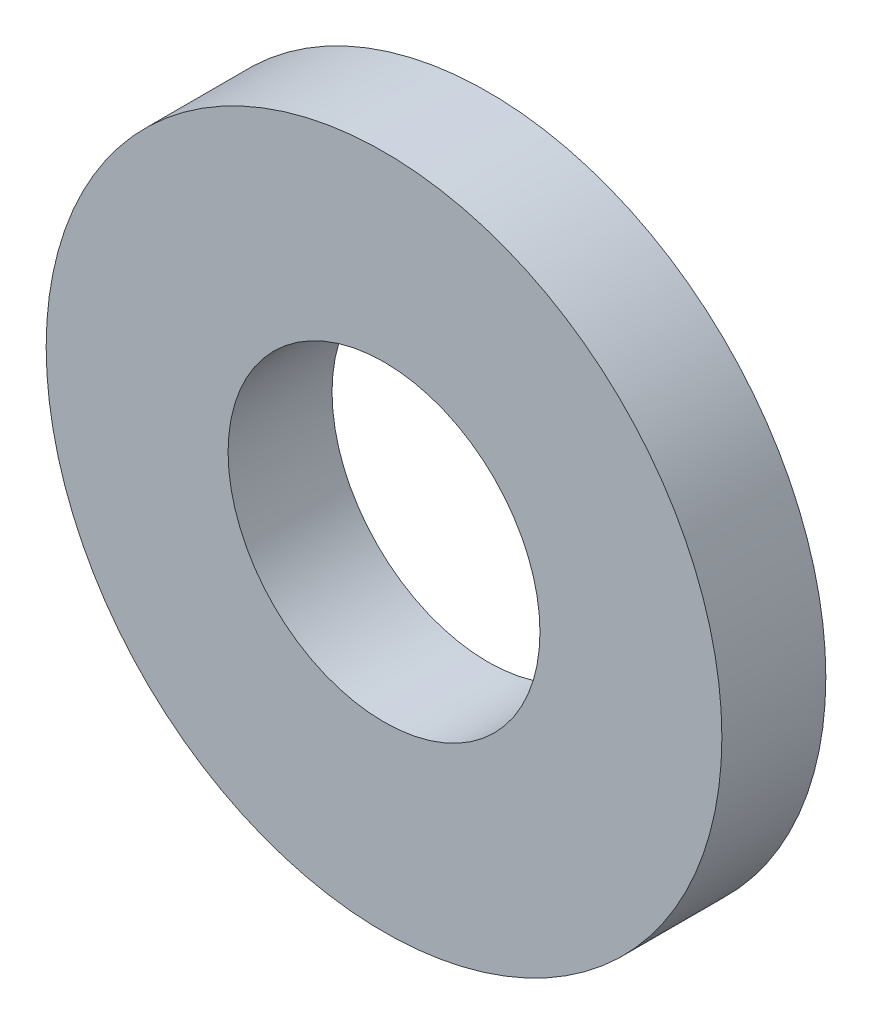
ISO-10303-21;
HEADER;
FILE_DESCRIPTION(('STEP AP214'),'2;1');
FILE_NAME('part.step','',(''),(''),'','','');
FILE_SCHEMA(('AUTOMOTIVE_DESIGN { 1 0 10303 214 1 1 1 1 }'));
ENDSEC;
DATA;
#1=APPLICATION_CONTEXT('core data for automotive mechanical design processes');
#2=APPLICATION_PROTOCOL_DEFINITION('international standard','automotive_design',2000,#1);
#3=PRODUCT_CONTEXT('',#1,'mechanical');
#4=PRODUCT('Part','Part','',(#3));
#5=PRODUCT_RELATED_PRODUCT_CATEGORY('part','',(#4));
#6=PRODUCT_DEFINITION_FORMATION('','',#4);
#7=PRODUCT_DEFINITION_CONTEXT('part definition',#1,'design');
#8=PRODUCT_DEFINITION('design','',#6,#7);
#9=PRODUCT_DEFINITION_SHAPE('','',#8);
#10=(LENGTH_UNIT() NAMED_UNIT(*) SI_UNIT(.MILLI.,.METRE.));
#11=(NAMED_UNIT(*) PLANE_ANGLE_UNIT() SI_UNIT($,.RADIAN.));
#12=(NAMED_UNIT(*) SI_UNIT($,.STERADIAN.) SOLID_ANGLE_UNIT());
#13=UNCERTAINTY_MEASURE_WITH_UNIT(LENGTH_MEASURE(1.E-05),#10,'distance_accuracy_value','');
#14=(GEOMETRIC_REPRESENTATION_CONTEXT(3) GLOBAL_UNCERTAINTY_ASSIGNED_CONTEXT((#13)) GLOBAL_UNIT_ASSIGNED_CONTEXT((#10,
#11,#12)) REPRESENTATION_CONTEXT('',''));
#15=CARTESIAN_POINT('',(0.,0.,0.));
#16=DIRECTION('',(0.,0.,1.));
#17=DIRECTION('',(1.,0.,0.));
#18=AXIS2_PLACEMENT_3D('',#15,#16,#17);
#19=CARTESIAN_POINT('',(0.,0.,4.));
#20=DIRECTION('',(0.,0.,1.));
#21=DIRECTION('',(1.,0.,0.));
#22=AXIS2_PLACEMENT_3D('',#19,#20,#21);
#23=PLANE('',#22);
#24=CARTESIAN_POINT('',(0.,0.,4.));
#25=DIRECTION('',(0.,0.,1.));
#26=DIRECTION('',(1.,0.,0.));
#27=AXIS2_PLACEMENT_3D('',#24,#25,#26);
#28=CIRCLE('',#27,13.);
#29=CARTESIAN_POINT('',(13.,0.,4.));
#30=VERTEX_POINT('',#29);
#31=EDGE_CURVE('E10',#30,#30,#28,.T.);
#32=ORIENTED_EDGE('',*,*,#31,.T.);
#33=EDGE_LOOP('',(#32));
#34=FACE_BOUND('',#33,.T.);
#35=CARTESIAN_POINT('',(0.,0.,4.));
#36=DIRECTION('',(0.,0.,1.));
#37=DIRECTION('',(1.,0.,0.));
#38=AXIS2_PLACEMENT_3D('',#35,#36,#37);
#39=CIRCLE('',#38,6.);
#40=CARTESIAN_POINT('',(6.,0.,4.));
#41=VERTEX_POINT('',#40);
#42=EDGE_CURVE('E43',#41,#41,#39,.T.);
#43=ORIENTED_EDGE('',*,*,#42,.F.);
#44=EDGE_LOOP('',(#43));
#45=FACE_BOUND('',#44,.T.);
#46=ADVANCED_FACE('F32',(#34,#45),#23,.T.);
#47=CARTESIAN_POINT('',(0.,0.,0.));
#48=DIRECTION('',(0.,0.,1.));
#49=DIRECTION('',(1.,0.,0.));
#50=AXIS2_PLACEMENT_3D('',#47,#48,#49);
#51=PLANE('',#50);
#52=CARTESIAN_POINT('',(0.,0.,0.));
#53=DIRECTION('',(0.,0.,1.));
#54=DIRECTION('',(1.,0.,0.));
#55=AXIS2_PLACEMENT_3D('',#52,#53,#54);
#56=CIRCLE('',#55,13.);
#57=CARTESIAN_POINT('',(13.,0.,0.));
#58=VERTEX_POINT('',#57);
#59=EDGE_CURVE('E36',#58,#58,#56,.T.);
#60=ORIENTED_EDGE('',*,*,#59,.F.);
#61=EDGE_LOOP('',(#60));
#62=FACE_BOUND('',#61,.T.);
#63=CARTESIAN_POINT('',(0.,0.,0.));
#64=DIRECTION('',(0.,0.,1.));
#65=DIRECTION('',(1.,0.,0.));
#66=AXIS2_PLACEMENT_3D('',#63,#64,#65);
#67=CIRCLE('',#66,6.);
#68=CARTESIAN_POINT('',(6.,0.,0.));
#69=VERTEX_POINT('',#68);
#70=EDGE_CURVE('E45',#69,#69,#67,.T.);
#71=ORIENTED_EDGE('',*,*,#70,.T.);
#72=EDGE_LOOP('',(#71));
#73=FACE_BOUND('',#72,.T.);
#74=ADVANCED_FACE('F55',(#62,#73),#51,.F.);
#75=CARTESIAN_POINT('',(0.,0.,4.));
#76=DIRECTION('',(0.,0.,-1.));
#77=DIRECTION('',(-1.,0.,0.));
#78=AXIS2_PLACEMENT_3D('',#75,#76,#77);
#79=CYLINDRICAL_SURFACE('',#78,13.);
#80=ORIENTED_EDGE('',*,*,#31,.F.);
#81=EDGE_LOOP('',(#80));
#82=FACE_BOUND('',#81,.T.);
#83=ORIENTED_EDGE('',*,*,#59,.T.);
#84=EDGE_LOOP('',(#83));
#85=FACE_BOUND('',#84,.T.);
#86=ADVANCED_FACE('F34',(#82,#85),#79,.T.);
#87=CARTESIAN_POINT('',(0.,0.,4.));
#88=DIRECTION('',(0.,0.,-1.));
#89=DIRECTION('',(-1.,0.,0.));
#90=AXIS2_PLACEMENT_3D('',#87,#88,#89);
#91=CYLINDRICAL_SURFACE('',#90,6.);
#92=ORIENTED_EDGE('',*,*,#42,.T.);
#93=EDGE_LOOP('',(#92));
#94=FACE_BOUND('',#93,.T.);
#95=ORIENTED_EDGE('',*,*,#70,.F.);
#96=EDGE_LOOP('',(#95));
#97=FACE_BOUND('',#96,.T.);
#98=ADVANCED_FACE('F51',(#94,#97),#91,.F.);
#99=CLOSED_SHELL('',(#46,#74,#86,#98));
#100=MANIFOLD_SOLID_BREP('B2',#99);
#101=ADVANCED_BREP_SHAPE_REPRESENTATION('',(#18,#100),#14);
#102=SHAPE_DEFINITION_REPRESENTATION(#9,#101);
ENDSEC;
END-ISO-10303-21;
